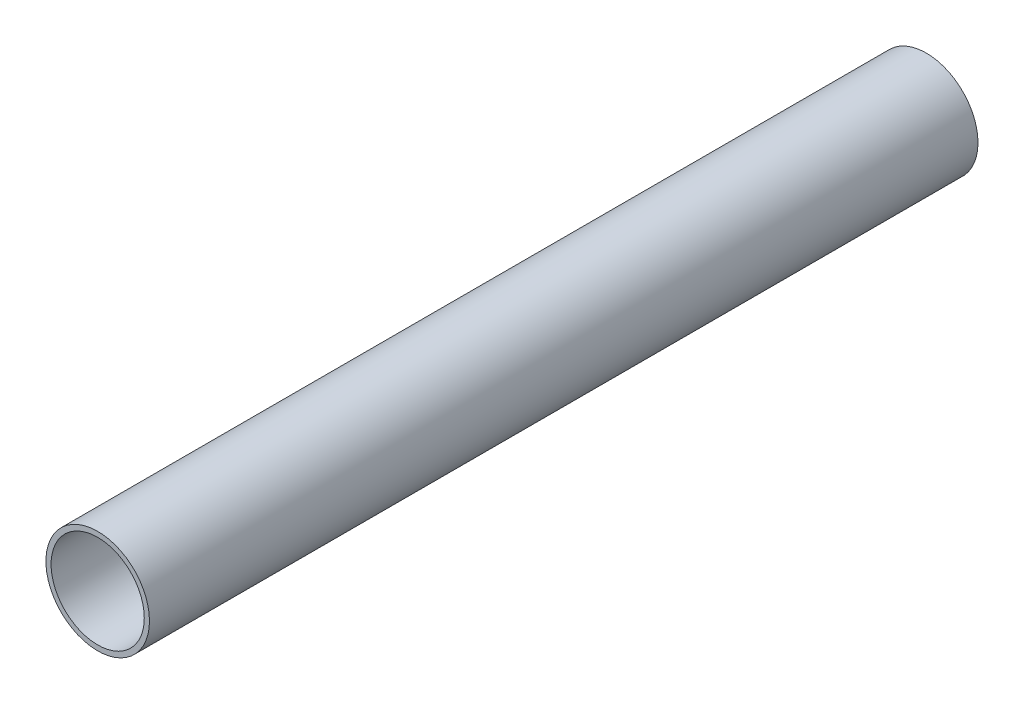
ISO-10303-21;
HEADER;
FILE_DESCRIPTION(('STEP AP214'),'2;1');
FILE_NAME('part.step','',(''),(''),'','','');
FILE_SCHEMA(('AUTOMOTIVE_DESIGN { 1 0 10303 214 1 1 1 1 }'));
ENDSEC;
DATA;
#1=APPLICATION_CONTEXT('core data for automotive mechanical design processes');
#2=APPLICATION_PROTOCOL_DEFINITION('international standard','automotive_design',2000,#1);
#3=PRODUCT_CONTEXT('',#1,'mechanical');
#4=PRODUCT('Part','Part','',(#3));
#5=PRODUCT_RELATED_PRODUCT_CATEGORY('part','',(#4));
#6=PRODUCT_DEFINITION_FORMATION('','',#4);
#7=PRODUCT_DEFINITION_CONTEXT('part definition',#1,'design');
#8=PRODUCT_DEFINITION('design','',#6,#7);
#9=PRODUCT_DEFINITION_SHAPE('','',#8);
#10=(LENGTH_UNIT() NAMED_UNIT(*) SI_UNIT(.MILLI.,.METRE.));
#11=(NAMED_UNIT(*) PLANE_ANGLE_UNIT() SI_UNIT($,.RADIAN.));
#12=(NAMED_UNIT(*) SI_UNIT($,.STERADIAN.) SOLID_ANGLE_UNIT());
#13=UNCERTAINTY_MEASURE_WITH_UNIT(LENGTH_MEASURE(1.E-05),#10,'distance_accuracy_value','');
#14=(GEOMETRIC_REPRESENTATION_CONTEXT(3) GLOBAL_UNCERTAINTY_ASSIGNED_CONTEXT((#13)) GLOBAL_UNIT_ASSIGNED_CONTEXT((#10,
#11,#12)) REPRESENTATION_CONTEXT('',''));
#15=CARTESIAN_POINT('',(0.,0.,0.));
#16=DIRECTION('',(0.,0.,1.));
#17=DIRECTION('',(1.,0.,0.));
#18=AXIS2_PLACEMENT_3D('',#15,#16,#17);
#19=CARTESIAN_POINT('',(0.,0.,160.));
#20=DIRECTION('',(0.,0.,-1.));
#21=DIRECTION('',(-1.,0.,0.));
#22=AXIS2_PLACEMENT_3D('',#19,#20,#21);
#23=CYLINDRICAL_SURFACE('',#22,10.);
#24=CARTESIAN_POINT('',(0.,0.,160.));
#25=DIRECTION('',(0.,0.,1.));
#26=DIRECTION('',(1.,0.,0.));
#27=AXIS2_PLACEMENT_3D('',#24,#25,#26);
#28=CIRCLE('',#27,10.);
#29=CARTESIAN_POINT('',(10.,0.,160.));
#30=VERTEX_POINT('',#29);
#31=EDGE_CURVE('E10',#30,#30,#28,.T.);
#32=ORIENTED_EDGE('',*,*,#31,.F.);
#33=EDGE_LOOP('',(#32));
#34=FACE_BOUND('',#33,.T.);
#35=CARTESIAN_POINT('',(0.,0.,0.));
#36=DIRECTION('',(0.,0.,1.));
#37=DIRECTION('',(1.,0.,0.));
#38=AXIS2_PLACEMENT_3D('',#35,#36,#37);
#39=CIRCLE('',#38,10.);
#40=CARTESIAN_POINT('',(10.,0.,0.));
#41=VERTEX_POINT('',#40);
#42=EDGE_CURVE('E42',#41,#41,#39,.T.);
#43=ORIENTED_EDGE('',*,*,#42,.T.);
#44=EDGE_LOOP('',(#43));
#45=FACE_BOUND('',#44,.T.);
#46=ADVANCED_FACE('F39',(#34,#45),#23,.T.);
#47=CARTESIAN_POINT('',(0.,0.,160.));
#48=DIRECTION('',(0.,0.,1.));
#49=DIRECTION('',(1.,0.,0.));
#50=AXIS2_PLACEMENT_3D('',#47,#48,#49);
#51=PLANE('',#50);
#52=CARTESIAN_POINT('',(0.,0.,160.));
#53=DIRECTION('',(0.,0.,1.));
#54=DIRECTION('',(1.,0.,0.));
#55=AXIS2_PLACEMENT_3D('',#52,#53,#54);
#56=CIRCLE('',#55,9.);
#57=CARTESIAN_POINT('',(9.,0.,160.));
#58=VERTEX_POINT('',#57);
#59=EDGE_CURVE('E51',#58,#58,#56,.T.);
#60=ORIENTED_EDGE('',*,*,#59,.F.);
#61=EDGE_LOOP('',(#60));
#62=FACE_BOUND('',#61,.T.);
#63=ORIENTED_EDGE('',*,*,#31,.T.);
#64=EDGE_LOOP('',(#63));
#65=FACE_BOUND('',#64,.T.);
#66=ADVANCED_FACE('F66',(#62,#65),#51,.T.);
#67=CARTESIAN_POINT('',(0.,0.,0.));
#68=DIRECTION('',(0.,0.,1.));
#69=DIRECTION('',(1.,0.,0.));
#70=AXIS2_PLACEMENT_3D('',#67,#68,#69);
#71=PLANE('',#70);
#72=CARTESIAN_POINT('',(0.,0.,0.));
#73=DIRECTION('',(0.,0.,1.));
#74=DIRECTION('',(1.,0.,0.));
#75=AXIS2_PLACEMENT_3D('',#72,#73,#74);
#76=CIRCLE('',#75,9.);
#77=CARTESIAN_POINT('',(9.,0.,0.));
#78=VERTEX_POINT('',#77);
#79=EDGE_CURVE('E49',#78,#78,#76,.T.);
#80=ORIENTED_EDGE('',*,*,#79,.T.);
#81=EDGE_LOOP('',(#80));
#82=FACE_BOUND('',#81,.T.);
#83=ORIENTED_EDGE('',*,*,#42,.F.);
#84=EDGE_LOOP('',(#83));
#85=FACE_BOUND('',#84,.T.);
#86=ADVANCED_FACE('F57',(#82,#85),#71,.F.);
#87=CARTESIAN_POINT('',(0.,0.,0.));
#88=DIRECTION('',(0.,0.,1.));
#89=DIRECTION('',(1.,0.,0.));
#90=AXIS2_PLACEMENT_3D('',#87,#88,#89);
#91=CYLINDRICAL_SURFACE('',#90,9.);
#92=ORIENTED_EDGE('',*,*,#79,.F.);
#93=EDGE_LOOP('',(#92));
#94=FACE_BOUND('',#93,.T.);
#95=ORIENTED_EDGE('',*,*,#59,.T.);
#96=EDGE_LOOP('',(#95));
#97=FACE_BOUND('',#96,.T.);
#98=ADVANCED_FACE('F60',(#94,#97),#91,.F.);
#99=CLOSED_SHELL('',(#46,#66,#86,#98));
#100=MANIFOLD_SOLID_BREP('B2',#99);
#101=ADVANCED_BREP_SHAPE_REPRESENTATION('',(#18,#100),#14);
#102=SHAPE_DEFINITION_REPRESENTATION(#9,#101);
ENDSEC;
END-ISO-10303-21;
